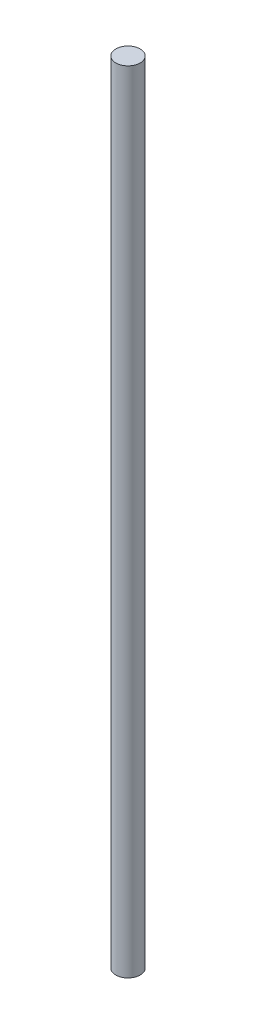
ISO-10303-21;
HEADER;
FILE_DESCRIPTION(('STEP AP214'),'2;1');
FILE_NAME('part.step','',(''),(''),'','','');
FILE_SCHEMA(('AUTOMOTIVE_DESIGN { 1 0 10303 214 1 1 1 1 }'));
ENDSEC;
DATA;
#1=APPLICATION_CONTEXT('core data for automotive mechanical design processes');
#2=APPLICATION_PROTOCOL_DEFINITION('international standard','automotive_design',2000,#1);
#3=PRODUCT_CONTEXT('',#1,'mechanical');
#4=PRODUCT('Part','Part','',(#3));
#5=PRODUCT_RELATED_PRODUCT_CATEGORY('part','',(#4));
#6=PRODUCT_DEFINITION_FORMATION('','',#4);
#7=PRODUCT_DEFINITION_CONTEXT('part definition',#1,'design');
#8=PRODUCT_DEFINITION('design','',#6,#7);
#9=PRODUCT_DEFINITION_SHAPE('','',#8);
#10=(LENGTH_UNIT() NAMED_UNIT(*) SI_UNIT(.MILLI.,.METRE.));
#11=(NAMED_UNIT(*) PLANE_ANGLE_UNIT() SI_UNIT($,.RADIAN.));
#12=(NAMED_UNIT(*) SI_UNIT($,.STERADIAN.) SOLID_ANGLE_UNIT());
#13=UNCERTAINTY_MEASURE_WITH_UNIT(LENGTH_MEASURE(1.E-05),#10,'distance_accuracy_value','');
#14=(GEOMETRIC_REPRESENTATION_CONTEXT(3) GLOBAL_UNCERTAINTY_ASSIGNED_CONTEXT((#13)) GLOBAL_UNIT_ASSIGNED_CONTEXT((#10,
#11,#12)) REPRESENTATION_CONTEXT('',''));
#15=CARTESIAN_POINT('',(0.,0.,0.));
#16=DIRECTION('',(0.,0.,1.));
#17=DIRECTION('',(1.,0.,0.));
#18=AXIS2_PLACEMENT_3D('',#15,#16,#17);
#19=CARTESIAN_POINT('',(0.,304.8,0.));
#20=DIRECTION('',(0.,-1.,0.));
#21=DIRECTION('',(0.,0.,-1.));
#22=AXIS2_PLACEMENT_3D('',#19,#20,#21);
#23=CYLINDRICAL_SURFACE('',#22,4.699);
#24=CARTESIAN_POINT('',(0.,304.8,0.));
#25=DIRECTION('',(0.,1.,0.));
#26=DIRECTION('',(0.,0.,1.));
#27=AXIS2_PLACEMENT_3D('',#24,#25,#26);
#28=CIRCLE('',#27,4.699);
#29=CARTESIAN_POINT('',(0.,304.8,-4.699));
#30=VERTEX_POINT('',#29);
#31=EDGE_CURVE('E10',#30,#30,#28,.T.);
#32=CARTESIAN_POINT('',(0.,0.,0.));
#33=DIRECTION('',(0.,1.,0.));
#34=DIRECTION('',(0.,0.,1.));
#35=AXIS2_PLACEMENT_3D('',#32,#33,#34);
#36=CIRCLE('',#35,4.699);
#37=CARTESIAN_POINT('',(0.,0.,-4.699));
#38=VERTEX_POINT('',#37);
#39=EDGE_CURVE('E34',#38,#38,#36,.T.);
#40=CARTESIAN_POINT('',(0.,304.8,-4.699));
#41=CARTESIAN_POINT('',(0.,301.625,-4.699));
#42=CARTESIAN_POINT('',(0.,298.45,-4.699));
#43=CARTESIAN_POINT('',(0.,292.1,-4.699));
#44=CARTESIAN_POINT('',(0.,288.925,-4.699));
#45=CARTESIAN_POINT('',(0.,282.575,-4.699));
#46=CARTESIAN_POINT('',(0.,279.4,-4.699));
#47=CARTESIAN_POINT('',(0.,273.05,-4.699));
#48=CARTESIAN_POINT('',(0.,269.875,-4.699));
#49=CARTESIAN_POINT('',(0.,263.525,-4.699));
#50=CARTESIAN_POINT('',(0.,260.35,-4.699));
#51=CARTESIAN_POINT('',(0.,254.,-4.699));
#52=CARTESIAN_POINT('',(0.,250.825,-4.699));
#53=CARTESIAN_POINT('',(0.,244.475,-4.699));
#54=CARTESIAN_POINT('',(0.,241.3,-4.699));
#55=CARTESIAN_POINT('',(0.,234.95,-4.699));
#56=CARTESIAN_POINT('',(0.,231.775,-4.699));
#57=CARTESIAN_POINT('',(0.,225.425,-4.699));
#58=CARTESIAN_POINT('',(0.,222.25,-4.699));
#59=CARTESIAN_POINT('',(0.,215.9,-4.699));
#60=CARTESIAN_POINT('',(0.,212.725,-4.699));
#61=CARTESIAN_POINT('',(0.,206.375,-4.699));
#62=CARTESIAN_POINT('',(0.,203.2,-4.699));
#63=CARTESIAN_POINT('',(0.,196.85,-4.699));
#64=CARTESIAN_POINT('',(0.,193.675,-4.699));
#65=CARTESIAN_POINT('',(0.,187.325,-4.699));
#66=CARTESIAN_POINT('',(0.,184.15,-4.699));
#67=CARTESIAN_POINT('',(0.,177.8,-4.699));
#68=CARTESIAN_POINT('',(0.,174.625,-4.699));
#69=CARTESIAN_POINT('',(0.,168.275,-4.699));
#70=CARTESIAN_POINT('',(0.,165.1,-4.699));
#71=CARTESIAN_POINT('',(0.,158.75,-4.699));
#72=CARTESIAN_POINT('',(0.,155.575,-4.699));
#73=CARTESIAN_POINT('',(0.,149.225,-4.699));
#74=CARTESIAN_POINT('',(0.,146.05,-4.699));
#75=CARTESIAN_POINT('',(0.,139.7,-4.699));
#76=CARTESIAN_POINT('',(0.,136.525,-4.699));
#77=CARTESIAN_POINT('',(0.,130.175,-4.699));
#78=CARTESIAN_POINT('',(0.,127.,-4.699));
#79=CARTESIAN_POINT('',(0.,120.65,-4.699));
#80=CARTESIAN_POINT('',(0.,117.475,-4.699));
#81=CARTESIAN_POINT('',(0.,111.125,-4.699));
#82=CARTESIAN_POINT('',(0.,107.95,-4.699));
#83=CARTESIAN_POINT('',(0.,101.6,-4.699));
#84=CARTESIAN_POINT('',(0.,98.425,-4.699));
#85=CARTESIAN_POINT('',(0.,92.075,-4.699));
#86=CARTESIAN_POINT('',(0.,88.9,-4.699));
#87=CARTESIAN_POINT('',(0.,82.55,-4.699));
#88=CARTESIAN_POINT('',(0.,79.375,-4.699));
#89=CARTESIAN_POINT('',(0.,73.025,-4.699));
#90=CARTESIAN_POINT('',(0.,69.85,-4.699));
#91=CARTESIAN_POINT('',(0.,63.5,-4.699));
#92=CARTESIAN_POINT('',(0.,60.325,-4.699));
#93=CARTESIAN_POINT('',(0.,53.975,-4.699));
#94=CARTESIAN_POINT('',(0.,50.8,-4.699));
#95=CARTESIAN_POINT('',(0.,44.45,-4.699));
#96=CARTESIAN_POINT('',(0.,41.275,-4.699));
#97=CARTESIAN_POINT('',(0.,34.925,-4.699));
#98=CARTESIAN_POINT('',(0.,31.75,-4.699));
#99=CARTESIAN_POINT('',(0.,25.4,-4.699));
#100=CARTESIAN_POINT('',(0.,22.225,-4.699));
#101=CARTESIAN_POINT('',(0.,15.875,-4.699));
#102=CARTESIAN_POINT('',(0.,12.7,-4.699));
#103=CARTESIAN_POINT('',(0.,6.35,-4.699));
#104=CARTESIAN_POINT('',(0.,3.175,-4.699));
#105=CARTESIAN_POINT('',(0.,0.,-4.699));
#106=B_SPLINE_CURVE_WITH_KNOTS('',3,(#40,#41,#42,#43,#44,#45,#46,#47,#48,#49,#50,#51,#52,#53,
#54,#55,#56,#57,#58,#59,#60,#61,#62,#63,#64,#65,#66,#67,#68,#69,#70,#71,#72,#73,#74,#75,#76,#77,
#78,#79,#80,#81,#82,#83,#84,#85,#86,#87,#88,#89,#90,#91,#92,#93,#94,#95,#96,#97,#98,#99,#100,
#101,#102,#103,#104,#105),.UNSPECIFIED.,.F.,.F.,(4,2,2,2,2,2,2,2,2,2,2,2,2,2,2,2,2,2,2,2,2,2,2,
2,2,2,2,2,2,2,2,2,4),(0.,9.52500000000001,19.05,28.575,38.1,47.625,57.15,66.675,76.2,
85.7250000000001,95.2500000000001,104.775,114.3,123.825,133.35,142.875,152.4,161.925,171.45,
180.975,190.5,200.025,209.55,219.075,228.6,238.125,247.65,257.175,266.7,276.225,285.75,295.275,
304.8),.UNSPECIFIED.);
#107=EDGE_CURVE('BSEAM31',#30,#38,#106,.T.);
#108=ORIENTED_EDGE('',*,*,#31,.F.);
#109=ORIENTED_EDGE('',*,*,#39,.T.);
#110=ORIENTED_EDGE('',*,*,#107,.T.);
#111=ORIENTED_EDGE('',*,*,#107,.F.);
#112=EDGE_LOOP('',(#108,#110,#109,#111));
#113=FACE_BOUND('',#112,.T.);
#114=ADVANCED_FACE('F31',(#113),#23,.T.);
#115=CARTESIAN_POINT('',(0.,304.8,0.));
#116=DIRECTION('',(0.,1.,0.));
#117=DIRECTION('',(0.,0.,1.));
#118=AXIS2_PLACEMENT_3D('',#115,#116,#117);
#119=PLANE('',#118);
#120=ORIENTED_EDGE('',*,*,#31,.T.);
#121=EDGE_LOOP('',(#120));
#122=FACE_BOUND('',#121,.T.);
#123=ADVANCED_FACE('F46',(#122),#119,.T.);
#124=CARTESIAN_POINT('',(0.,0.,0.));
#125=DIRECTION('',(0.,1.,0.));
#126=DIRECTION('',(0.,0.,1.));
#127=AXIS2_PLACEMENT_3D('',#124,#125,#126);
#128=PLANE('',#127);
#129=ORIENTED_EDGE('',*,*,#39,.F.);
#130=EDGE_LOOP('',(#129));
#131=FACE_BOUND('',#130,.T.);
#132=ADVANCED_FACE('F44',(#131),#128,.F.);
#133=CLOSED_SHELL('',(#114,#123,#132));
#134=MANIFOLD_SOLID_BREP('B2',#133);
#135=ADVANCED_BREP_SHAPE_REPRESENTATION('',(#18,#134),#14);
#136=SHAPE_DEFINITION_REPRESENTATION(#9,#135);
ENDSEC;
END-ISO-10303-21;
